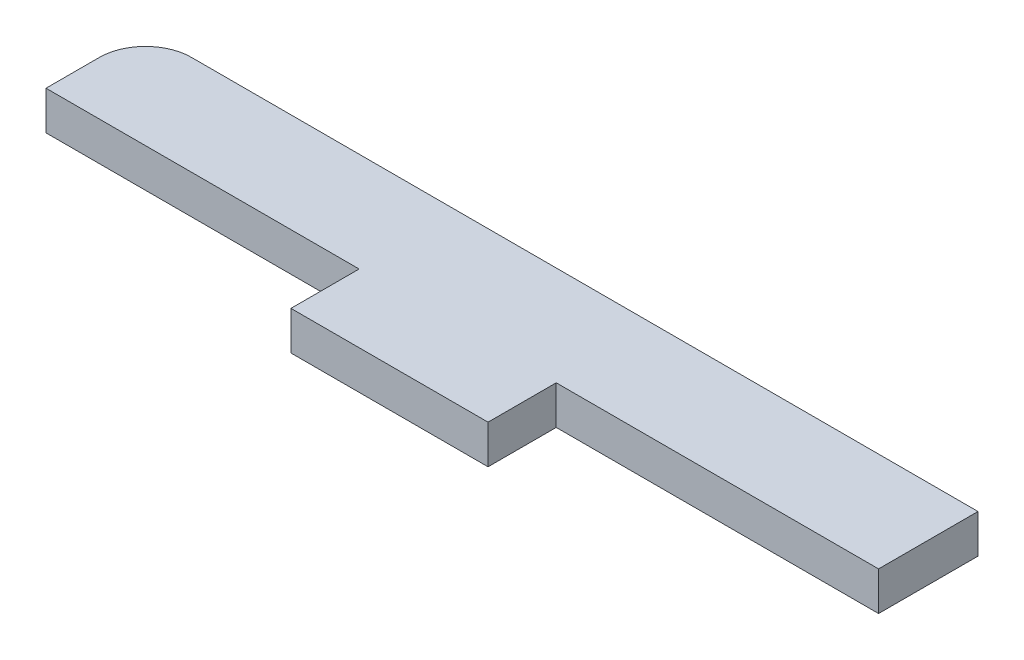
ISO-10303-21;
HEADER;
FILE_DESCRIPTION(('STEP AP214'),'2;1');
FILE_NAME('part.step','',(''),(''),'','','');
FILE_SCHEMA(('AUTOMOTIVE_DESIGN { 1 0 10303 214 1 1 1 1 }'));
ENDSEC;
DATA;
#1=APPLICATION_CONTEXT('core data for automotive mechanical design processes');
#2=APPLICATION_PROTOCOL_DEFINITION('international standard','automotive_design',2000,#1);
#3=PRODUCT_CONTEXT('',#1,'mechanical');
#4=PRODUCT('Part','Part','',(#3));
#5=PRODUCT_RELATED_PRODUCT_CATEGORY('part','',(#4));
#6=PRODUCT_DEFINITION_FORMATION('','',#4);
#7=PRODUCT_DEFINITION_CONTEXT('part definition',#1,'design');
#8=PRODUCT_DEFINITION('design','',#6,#7);
#9=PRODUCT_DEFINITION_SHAPE('','',#8);
#10=(LENGTH_UNIT() NAMED_UNIT(*) SI_UNIT(.MILLI.,.METRE.));
#11=(NAMED_UNIT(*) PLANE_ANGLE_UNIT() SI_UNIT($,.RADIAN.));
#12=(NAMED_UNIT(*) SI_UNIT($,.STERADIAN.) SOLID_ANGLE_UNIT());
#13=UNCERTAINTY_MEASURE_WITH_UNIT(LENGTH_MEASURE(1.E-05),#10,'distance_accuracy_value','');
#14=(GEOMETRIC_REPRESENTATION_CONTEXT(3) GLOBAL_UNCERTAINTY_ASSIGNED_CONTEXT((#13)) GLOBAL_UNIT_ASSIGNED_CONTEXT((#10,
#11,#12)) REPRESENTATION_CONTEXT('',''));
#15=CARTESIAN_POINT('',(0.,0.,0.));
#16=DIRECTION('',(0.,0.,1.));
#17=DIRECTION('',(1.,0.,0.));
#18=AXIS2_PLACEMENT_3D('',#15,#16,#17);
#19=CARTESIAN_POINT('',(-431.049654050802,5.334,-194.929284321898));
#20=DIRECTION('',(1.,0.,0.));
#21=DIRECTION('',(0.,0.,-1.));
#22=AXIS2_PLACEMENT_3D('',#19,#20,#21);
#23=PLANE('',#22);
#24=DIRECTION('',(0.,0.,1.));
#25=VECTOR('',#24,1.);
#26=CARTESIAN_POINT('',(-431.049654050802,0.,-194.929284321898));
#27=LINE('',#26,#25);
#28=CARTESIAN_POINT('',(-431.049654050802,0.,-188.579284321898));
#29=VERTEX_POINT('',#28);
#30=CARTESIAN_POINT('',(-431.049654050802,0.,-181.21698954505));
#31=VERTEX_POINT('',#30);
#32=EDGE_CURVE('E128',#29,#31,#27,.T.);
#33=ORIENTED_EDGE('',*,*,#32,.T.);
#34=DIRECTION('',(0.,1.,0.));
#35=VECTOR('',#34,1.);
#36=CARTESIAN_POINT('',(-431.049654050802,0.,-181.21698954505));
#37=LINE('',#36,#35);
#38=CARTESIAN_POINT('',(-431.049654050802,5.334,-181.21698954505));
#39=VERTEX_POINT('',#38);
#40=EDGE_CURVE('E58',#31,#39,#37,.T.);
#41=ORIENTED_EDGE('',*,*,#40,.T.);
#42=DIRECTION('',(0.,0.,1.));
#43=VECTOR('',#42,1.);
#44=CARTESIAN_POINT('',(-431.049654050802,5.334,-194.929284321898));
#45=LINE('',#44,#43);
#46=CARTESIAN_POINT('',(-431.049654050802,5.334,-188.579284321898));
#47=VERTEX_POINT('',#46);
#48=EDGE_CURVE('E138',#47,#39,#45,.T.);
#49=ORIENTED_EDGE('',*,*,#48,.F.);
#50=DIRECTION('',(0.,-1.,0.));
#51=VECTOR('',#50,1.);
#52=CARTESIAN_POINT('',(-431.049654050802,5.334,-188.579284321898));
#53=LINE('',#52,#51);
#54=EDGE_CURVE('E142',#47,#29,#53,.T.);
#55=ORIENTED_EDGE('',*,*,#54,.T.);
#56=EDGE_LOOP('',(#33,#41,#49,#55));
#57=FACE_BOUND('',#56,.T.);
#58=ADVANCED_FACE('F35',(#57),#23,.F.);
#59=CARTESIAN_POINT('',(-431.049654050802,5.334,-171.815284321898));
#60=DIRECTION('',(0.,0.,-1.));
#61=DIRECTION('',(-1.,0.,0.));
#62=AXIS2_PLACEMENT_3D('',#59,#60,#61);
#63=PLANE('',#62);
#64=DIRECTION('',(1.,0.,0.));
#65=VECTOR('',#64,1.);
#66=CARTESIAN_POINT('',(-431.049654050802,0.,-171.815284321898));
#67=LINE('',#66,#65);
#68=CARTESIAN_POINT('',(-387.869654050802,0.,-171.815284321898));
#69=VERTEX_POINT('',#68);
#70=CARTESIAN_POINT('',(-360.691654050802,0.,-171.815284321898));
#71=VERTEX_POINT('',#70);
#72=EDGE_CURVE('E120',#69,#71,#67,.T.);
#73=ORIENTED_EDGE('',*,*,#72,.T.);
#74=DIRECTION('',(0.,1.,0.));
#75=VECTOR('',#74,1.);
#76=CARTESIAN_POINT('',(-360.691654050802,0.,-171.815284321898));
#77=LINE('',#76,#75);
#78=CARTESIAN_POINT('',(-360.691654050802,5.334,-171.815284321898));
#79=VERTEX_POINT('',#78);
#80=EDGE_CURVE('E104',#71,#79,#77,.T.);
#81=ORIENTED_EDGE('',*,*,#80,.T.);
#82=DIRECTION('',(1.,0.,0.));
#83=VECTOR('',#82,1.);
#84=CARTESIAN_POINT('',(-431.049654050802,5.334,-171.815284321898));
#85=LINE('',#84,#83);
#86=CARTESIAN_POINT('',(-387.869654050802,5.334,-171.815284321898));
#87=VERTEX_POINT('',#86);
#88=EDGE_CURVE('E182',#87,#79,#85,.T.);
#89=ORIENTED_EDGE('',*,*,#88,.F.);
#90=DIRECTION('',(0.,1.,0.));
#91=VECTOR('',#90,1.);
#92=CARTESIAN_POINT('',(-387.869654050802,0.,-171.815284321898));
#93=LINE('',#92,#91);
#94=EDGE_CURVE('E126',#69,#87,#93,.T.);
#95=ORIENTED_EDGE('',*,*,#94,.F.);
#96=EDGE_LOOP('',(#73,#81,#89,#95));
#97=FACE_BOUND('',#96,.T.);
#98=ADVANCED_FACE('F125',(#97),#63,.F.);
#99=CARTESIAN_POINT('',(-316.241654050802,5.334,-194.929284321898));
#100=DIRECTION('',(-1.,0.,0.));
#101=DIRECTION('',(0.,0.,1.));
#102=AXIS2_PLACEMENT_3D('',#99,#100,#101);
#103=PLANE('',#102);
#104=DIRECTION('',(0.,0.,-1.));
#105=VECTOR('',#104,1.);
#106=CARTESIAN_POINT('',(-316.241654050802,5.334,-194.929284321898));
#107=LINE('',#106,#105);
#108=CARTESIAN_POINT('',(-316.241654050802,5.334,-181.21698954505));
#109=VERTEX_POINT('',#108);
#110=CARTESIAN_POINT('',(-316.241654050802,5.334,-194.929284321898));
#111=VERTEX_POINT('',#110);
#112=EDGE_CURVE('E161',#109,#111,#107,.T.);
#113=ORIENTED_EDGE('',*,*,#112,.F.);
#114=DIRECTION('',(0.,1.,0.));
#115=VECTOR('',#114,1.);
#116=CARTESIAN_POINT('',(-316.241654050802,0.,-181.21698954505));
#117=LINE('',#116,#115);
#118=CARTESIAN_POINT('',(-316.241654050802,0.,-181.21698954505));
#119=VERTEX_POINT('',#118);
#120=EDGE_CURVE('E112',#119,#109,#117,.T.);
#121=ORIENTED_EDGE('',*,*,#120,.F.);
#122=DIRECTION('',(0.,0.,-1.));
#123=VECTOR('',#122,1.);
#124=CARTESIAN_POINT('',(-316.241654050802,0.,-194.929284321898));
#125=LINE('',#124,#123);
#126=CARTESIAN_POINT('',(-316.241654050802,0.,-194.929284321898));
#127=VERTEX_POINT('',#126);
#128=EDGE_CURVE('E127',#119,#127,#125,.T.);
#129=ORIENTED_EDGE('',*,*,#128,.T.);
#130=DIRECTION('',(0.,-1.,0.));
#131=VECTOR('',#130,1.);
#132=CARTESIAN_POINT('',(-316.241654050802,5.334,-194.929284321898));
#133=LINE('',#132,#131);
#134=EDGE_CURVE('E139',#111,#127,#133,.T.);
#135=ORIENTED_EDGE('',*,*,#134,.F.);
#136=EDGE_LOOP('',(#113,#121,#129,#135));
#137=FACE_BOUND('',#136,.T.);
#138=ADVANCED_FACE('F202',(#137),#103,.F.);
#139=CARTESIAN_POINT('',(-431.049654050802,5.334,-194.929284321898));
#140=DIRECTION('',(0.,0.,1.));
#141=DIRECTION('',(1.,0.,0.));
#142=AXIS2_PLACEMENT_3D('',#139,#140,#141);
#143=PLANE('',#142);
#144=DIRECTION('',(-1.,0.,0.));
#145=VECTOR('',#144,1.);
#146=CARTESIAN_POINT('',(-431.049654050802,0.,-194.929284321898));
#147=LINE('',#146,#145);
#148=CARTESIAN_POINT('',(-424.699654050802,0.,-194.929284321898));
#149=VERTEX_POINT('',#148);
#150=EDGE_CURVE('E130',#127,#149,#147,.T.);
#151=ORIENTED_EDGE('',*,*,#150,.T.);
#152=DIRECTION('',(0.,-1.,0.));
#153=VECTOR('',#152,1.);
#154=CARTESIAN_POINT('',(-424.699654050802,5.334,-194.929284321898));
#155=LINE('',#154,#153);
#156=CARTESIAN_POINT('',(-424.699654050802,5.334,-194.929284321898));
#157=VERTEX_POINT('',#156);
#158=EDGE_CURVE('E43',#149,#157,#155,.F.);
#159=ORIENTED_EDGE('',*,*,#158,.T.);
#160=DIRECTION('',(-1.,0.,0.));
#161=VECTOR('',#160,1.);
#162=CARTESIAN_POINT('',(-431.049654050802,5.334,-194.929284321898));
#163=LINE('',#162,#161);
#164=EDGE_CURVE('E143',#111,#157,#163,.T.);
#165=ORIENTED_EDGE('',*,*,#164,.F.);
#166=ORIENTED_EDGE('',*,*,#134,.T.);
#167=EDGE_LOOP('',(#151,#159,#165,#166));
#168=FACE_BOUND('',#167,.T.);
#169=ADVANCED_FACE('F151',(#168),#143,.F.);
#170=CARTESIAN_POINT('',(0.,5.334,0.));
#171=DIRECTION('',(0.,1.,0.));
#172=DIRECTION('',(0.,0.,1.));
#173=AXIS2_PLACEMENT_3D('',#170,#171,#172);
#174=PLANE('',#173);
#175=DIRECTION('',(0.,0.,1.));
#176=VECTOR('',#175,1.);
#177=CARTESIAN_POINT('',(-360.691654050802,5.334,-181.21698954505));
#178=LINE('',#177,#176);
#179=CARTESIAN_POINT('',(-360.691654050802,5.334,-181.21698954505));
#180=VERTEX_POINT('',#179);
#181=EDGE_CURVE('E107',#180,#79,#178,.T.);
#182=ORIENTED_EDGE('',*,*,#181,.F.);
#183=DIRECTION('',(-1.,0.,0.));
#184=VECTOR('',#183,1.);
#185=CARTESIAN_POINT('',(-360.691654050802,5.334,-181.21698954505));
#186=LINE('',#185,#184);
#187=EDGE_CURVE('E122',#109,#180,#186,.T.);
#188=ORIENTED_EDGE('',*,*,#187,.F.);
#189=ORIENTED_EDGE('',*,*,#112,.T.);
#190=ORIENTED_EDGE('',*,*,#164,.T.);
#191=CARTESIAN_POINT('',(-424.699654050802,5.334,-188.579284321898));
#192=DIRECTION('',(0.,1.,0.));
#193=DIRECTION('',(0.,0.,1.));
#194=AXIS2_PLACEMENT_3D('',#191,#192,#193);
#195=CIRCLE('',#194,6.35);
#196=EDGE_CURVE('E11',#157,#47,#195,.T.);
#197=ORIENTED_EDGE('',*,*,#196,.T.);
#198=ORIENTED_EDGE('',*,*,#48,.T.);
#199=DIRECTION('',(-1.,0.,0.));
#200=VECTOR('',#199,1.);
#201=CARTESIAN_POINT('',(-387.869654050802,5.334,-181.21698954505));
#202=LINE('',#201,#200);
#203=CARTESIAN_POINT('',(-387.869654050802,5.334,-181.21698954505));
#204=VERTEX_POINT('',#203);
#205=EDGE_CURVE('E171',#204,#39,#202,.T.);
#206=ORIENTED_EDGE('',*,*,#205,.F.);
#207=DIRECTION('',(0.,0.,-1.));
#208=VECTOR('',#207,1.);
#209=CARTESIAN_POINT('',(-387.869654050802,5.334,-181.21698954505));
#210=LINE('',#209,#208);
#211=EDGE_CURVE('E174',#87,#204,#210,.T.);
#212=ORIENTED_EDGE('',*,*,#211,.F.);
#213=ORIENTED_EDGE('',*,*,#88,.T.);
#214=EDGE_LOOP('',(#182,#188,#189,#190,#197,#198,#206,#212,#213));
#215=FACE_BOUND('',#214,.T.);
#216=ADVANCED_FACE('F156',(#215),#174,.T.);
#217=CARTESIAN_POINT('',(0.,0.,0.));
#218=DIRECTION('',(0.,1.,0.));
#219=DIRECTION('',(0.,0.,1.));
#220=AXIS2_PLACEMENT_3D('',#217,#218,#219);
#221=PLANE('',#220);
#222=DIRECTION('',(-1.,0.,0.));
#223=VECTOR('',#222,1.);
#224=CARTESIAN_POINT('',(-360.691654050802,0.,-181.21698954505));
#225=LINE('',#224,#223);
#226=CARTESIAN_POINT('',(-360.691654050802,0.,-181.21698954505));
#227=VERTEX_POINT('',#226);
#228=EDGE_CURVE('E113',#119,#227,#225,.T.);
#229=ORIENTED_EDGE('',*,*,#228,.T.);
#230=DIRECTION('',(0.,0.,1.));
#231=VECTOR('',#230,1.);
#232=CARTESIAN_POINT('',(-360.691654050802,0.,-181.21698954505));
#233=LINE('',#232,#231);
#234=EDGE_CURVE('E50',#227,#71,#233,.T.);
#235=ORIENTED_EDGE('',*,*,#234,.T.);
#236=ORIENTED_EDGE('',*,*,#72,.F.);
#237=DIRECTION('',(0.,0.,-1.));
#238=VECTOR('',#237,1.);
#239=CARTESIAN_POINT('',(-387.869654050802,0.,-181.21698954505));
#240=LINE('',#239,#238);
#241=CARTESIAN_POINT('',(-387.869654050802,0.,-181.21698954505));
#242=VERTEX_POINT('',#241);
#243=EDGE_CURVE('E167',#69,#242,#240,.T.);
#244=ORIENTED_EDGE('',*,*,#243,.T.);
#245=DIRECTION('',(-1.,0.,0.));
#246=VECTOR('',#245,1.);
#247=CARTESIAN_POINT('',(-387.869654050802,0.,-181.21698954505));
#248=LINE('',#247,#246);
#249=EDGE_CURVE('E166',#242,#31,#248,.T.);
#250=ORIENTED_EDGE('',*,*,#249,.T.);
#251=ORIENTED_EDGE('',*,*,#32,.F.);
#252=CARTESIAN_POINT('',(-424.699654050802,0.,-188.579284321898));
#253=DIRECTION('',(0.,1.,0.));
#254=DIRECTION('',(0.,0.,1.));
#255=AXIS2_PLACEMENT_3D('',#252,#253,#254);
#256=CIRCLE('',#255,6.35);
#257=EDGE_CURVE('E146',#29,#149,#256,.F.);
#258=ORIENTED_EDGE('',*,*,#257,.T.);
#259=ORIENTED_EDGE('',*,*,#150,.F.);
#260=ORIENTED_EDGE('',*,*,#128,.F.);
#261=EDGE_LOOP('',(#229,#235,#236,#244,#250,#251,#258,#259,#260));
#262=FACE_BOUND('',#261,.T.);
#263=ADVANCED_FACE('F118',(#262),#221,.F.);
#264=CARTESIAN_POINT('',(-424.699654050802,5.334,-188.579284321898));
#265=DIRECTION('',(0.,-1.,0.));
#266=DIRECTION('',(0.,0.,-1.));
#267=AXIS2_PLACEMENT_3D('',#264,#265,#266);
#268=CYLINDRICAL_SURFACE('',#267,6.35);
#269=ORIENTED_EDGE('',*,*,#196,.F.);
#270=ORIENTED_EDGE('',*,*,#158,.F.);
#271=ORIENTED_EDGE('',*,*,#257,.F.);
#272=ORIENTED_EDGE('',*,*,#54,.F.);
#273=EDGE_LOOP('',(#269,#270,#271,#272));
#274=FACE_BOUND('',#273,.T.);
#275=ADVANCED_FACE('F37',(#274),#268,.T.);
#276=CARTESIAN_POINT('',(-387.869654050802,0.,-181.21698954505));
#277=DIRECTION('',(1.,0.,0.));
#278=DIRECTION('',(0.,0.,-1.));
#279=AXIS2_PLACEMENT_3D('',#276,#277,#278);
#280=PLANE('',#279);
#281=ORIENTED_EDGE('',*,*,#211,.T.);
#282=DIRECTION('',(0.,1.,0.));
#283=VECTOR('',#282,1.);
#284=CARTESIAN_POINT('',(-387.869654050802,0.,-181.21698954505));
#285=LINE('',#284,#283);
#286=EDGE_CURVE('E168',#242,#204,#285,.T.);
#287=ORIENTED_EDGE('',*,*,#286,.F.);
#288=ORIENTED_EDGE('',*,*,#243,.F.);
#289=ORIENTED_EDGE('',*,*,#94,.T.);
#290=EDGE_LOOP('',(#281,#287,#288,#289));
#291=FACE_BOUND('',#290,.T.);
#292=ADVANCED_FACE('F187',(#291),#280,.F.);
#293=CARTESIAN_POINT('',(-387.869654050802,0.,-181.21698954505));
#294=DIRECTION('',(0.,0.,-1.));
#295=DIRECTION('',(-1.,0.,0.));
#296=AXIS2_PLACEMENT_3D('',#293,#294,#295);
#297=PLANE('',#296);
#298=ORIENTED_EDGE('',*,*,#205,.T.);
#299=ORIENTED_EDGE('',*,*,#40,.F.);
#300=ORIENTED_EDGE('',*,*,#249,.F.);
#301=ORIENTED_EDGE('',*,*,#286,.T.);
#302=EDGE_LOOP('',(#298,#299,#300,#301));
#303=FACE_BOUND('',#302,.T.);
#304=ADVANCED_FACE('F188',(#303),#297,.F.);
#305=CARTESIAN_POINT('',(-360.691654050802,0.,-181.21698954505));
#306=DIRECTION('',(-1.,0.,0.));
#307=DIRECTION('',(0.,0.,1.));
#308=AXIS2_PLACEMENT_3D('',#305,#306,#307);
#309=PLANE('',#308);
#310=ORIENTED_EDGE('',*,*,#181,.T.);
#311=ORIENTED_EDGE('',*,*,#80,.F.);
#312=ORIENTED_EDGE('',*,*,#234,.F.);
#313=DIRECTION('',(0.,1.,0.));
#314=VECTOR('',#313,1.);
#315=CARTESIAN_POINT('',(-360.691654050802,0.,-181.21698954505));
#316=LINE('',#315,#314);
#317=EDGE_CURVE('E177',#227,#180,#316,.T.);
#318=ORIENTED_EDGE('',*,*,#317,.T.);
#319=EDGE_LOOP('',(#310,#311,#312,#318));
#320=FACE_BOUND('',#319,.T.);
#321=ADVANCED_FACE('F105',(#320),#309,.F.);
#322=CARTESIAN_POINT('',(-360.691654050802,0.,-181.21698954505));
#323=DIRECTION('',(0.,0.,-1.));
#324=DIRECTION('',(-1.,0.,0.));
#325=AXIS2_PLACEMENT_3D('',#322,#323,#324);
#326=PLANE('',#325);
#327=ORIENTED_EDGE('',*,*,#187,.T.);
#328=ORIENTED_EDGE('',*,*,#317,.F.);
#329=ORIENTED_EDGE('',*,*,#228,.F.);
#330=ORIENTED_EDGE('',*,*,#120,.T.);
#331=EDGE_LOOP('',(#327,#328,#329,#330));
#332=FACE_BOUND('',#331,.T.);
#333=ADVANCED_FACE('F195',(#332),#326,.F.);
#334=CLOSED_SHELL('',(#58,#98,#138,#169,#216,#263,#275,#292,#304,#321,#333));
#335=MANIFOLD_SOLID_BREP('B2',#334);
#336=ADVANCED_BREP_SHAPE_REPRESENTATION('',(#18,#335),#14);
#337=SHAPE_DEFINITION_REPRESENTATION(#9,#336);
ENDSEC;
END-ISO-10303-21;
